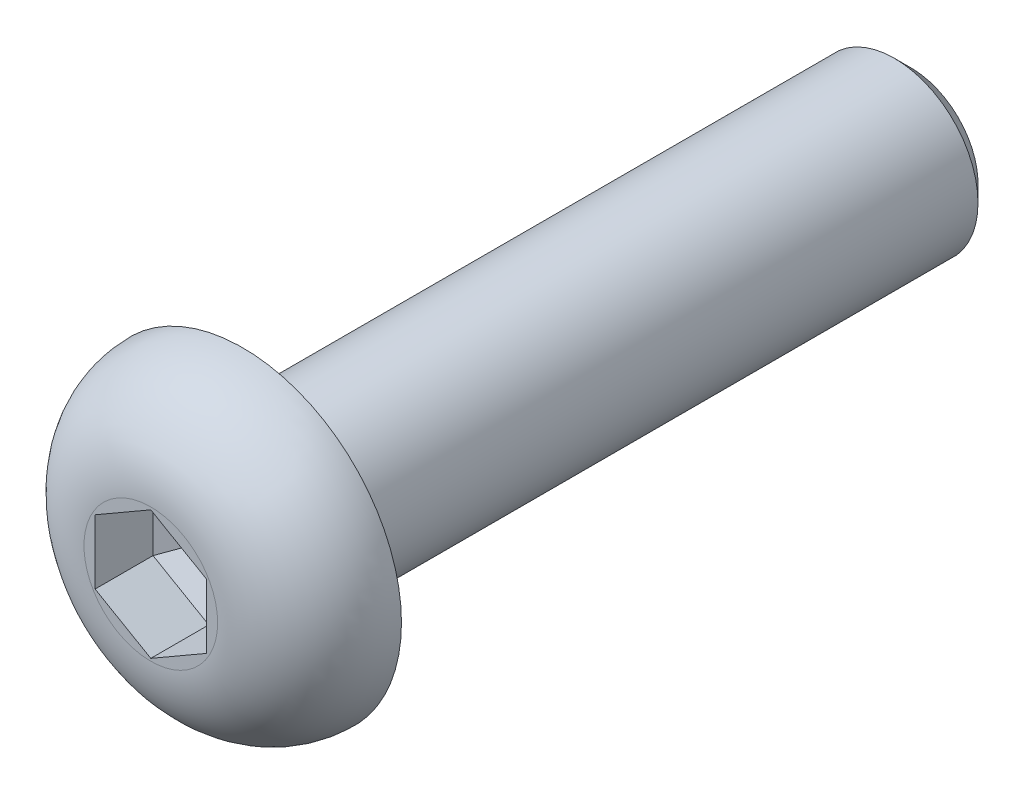
ISO-10303-21;
HEADER;
FILE_DESCRIPTION(('STEP AP214'),'2;1');
FILE_NAME('part.step','',(''),(''),'','','');
FILE_SCHEMA(('AUTOMOTIVE_DESIGN { 1 0 10303 214 1 1 1 1 }'));
ENDSEC;
DATA;
#1=APPLICATION_CONTEXT('core data for automotive mechanical design processes');
#2=APPLICATION_PROTOCOL_DEFINITION('international standard','automotive_design',2000,#1);
#3=PRODUCT_CONTEXT('',#1,'mechanical');
#4=PRODUCT('Part','Part','',(#3));
#5=PRODUCT_RELATED_PRODUCT_CATEGORY('part','',(#4));
#6=PRODUCT_DEFINITION_FORMATION('','',#4);
#7=PRODUCT_DEFINITION_CONTEXT('part definition',#1,'design');
#8=PRODUCT_DEFINITION('design','',#6,#7);
#9=PRODUCT_DEFINITION_SHAPE('','',#8);
#10=(LENGTH_UNIT() NAMED_UNIT(*) SI_UNIT(.MILLI.,.METRE.));
#11=(NAMED_UNIT(*) PLANE_ANGLE_UNIT() SI_UNIT($,.RADIAN.));
#12=(NAMED_UNIT(*) SI_UNIT($,.STERADIAN.) SOLID_ANGLE_UNIT());
#13=UNCERTAINTY_MEASURE_WITH_UNIT(LENGTH_MEASURE(1.E-05),#10,'distance_accuracy_value','');
#14=(GEOMETRIC_REPRESENTATION_CONTEXT(3) GLOBAL_UNCERTAINTY_ASSIGNED_CONTEXT((#13)) GLOBAL_UNIT_ASSIGNED_CONTEXT((#10,
#11,#12)) REPRESENTATION_CONTEXT('',''));
#15=CARTESIAN_POINT('',(0.,0.,0.));
#16=DIRECTION('',(0.,0.,1.));
#17=DIRECTION('',(1.,0.,0.));
#18=AXIS2_PLACEMENT_3D('',#15,#16,#17);
#19=CARTESIAN_POINT('',(0.,0.,0.));
#20=DIRECTION('',(0.,0.,1.));
#21=DIRECTION('',(1.,0.,0.));
#22=AXIS2_PLACEMENT_3D('',#19,#20,#21);
#23=PLANE('',#22);
#24=CARTESIAN_POINT('',(0.,0.,0.));
#25=DIRECTION('',(0.,0.,1.));
#26=DIRECTION('',(1.,0.,0.));
#27=AXIS2_PLACEMENT_3D('',#24,#25,#26);
#28=CIRCLE('',#27,1.6);
#29=CARTESIAN_POINT('',(1.6,0.,0.));
#30=VERTEX_POINT('',#29);
#31=EDGE_CURVE('E11',#30,#30,#28,.T.);
#32=ORIENTED_EDGE('',*,*,#31,.T.);
#33=EDGE_LOOP('',(#32));
#34=FACE_BOUND('',#33,.T.);
#35=CARTESIAN_POINT('',(0.,0.,0.));
#36=DIRECTION('',(0.,0.,1.));
#37=DIRECTION('',(1.,0.,0.));
#38=AXIS2_PLACEMENT_3D('',#35,#36,#37);
#39=CIRCLE('',#38,2.85);
#40=CARTESIAN_POINT('',(2.85,0.,0.));
#41=VERTEX_POINT('',#40);
#42=EDGE_CURVE('E148',#41,#41,#39,.T.);
#43=ORIENTED_EDGE('',*,*,#42,.F.);
#44=EDGE_LOOP('',(#43));
#45=FACE_BOUND('',#44,.T.);
#46=ADVANCED_FACE('F40',(#34,#45),#23,.F.);
#47=CARTESIAN_POINT('',(0.,0.,1.65));
#48=DIRECTION('',(0.,0.,1.));
#49=DIRECTION('',(1.,0.,0.));
#50=AXIS2_PLACEMENT_3D('',#47,#48,#49);
#51=PLANE('',#50);
#52=DIRECTION('',(0.,1.,0.));
#53=VECTOR('',#52,1.);
#54=CARTESIAN_POINT('',(1.,-0.577350269189626,1.65));
#55=LINE('',#54,#53);
#56=CARTESIAN_POINT('',(1.,-0.577350269189626,1.65));
#57=VERTEX_POINT('',#56);
#58=CARTESIAN_POINT('',(1.,0.577350269189626,1.65));
#59=VERTEX_POINT('',#58);
#60=EDGE_CURVE('E129',#57,#59,#55,.T.);
#61=ORIENTED_EDGE('',*,*,#60,.F.);
#62=DIRECTION('',(0.866025403784439,0.5,0.));
#63=VECTOR('',#62,1.);
#64=CARTESIAN_POINT('',(0.,-1.15470053837925,1.65));
#65=LINE('',#64,#63);
#66=CARTESIAN_POINT('',(0.,-1.15470053837925,1.65));
#67=VERTEX_POINT('',#66);
#68=EDGE_CURVE('E143',#67,#57,#65,.T.);
#69=ORIENTED_EDGE('',*,*,#68,.F.);
#70=DIRECTION('',(0.866025403784439,-0.5,0.));
#71=VECTOR('',#70,1.);
#72=CARTESIAN_POINT('',(-1.,-0.577350269189626,1.65));
#73=LINE('',#72,#71);
#74=CARTESIAN_POINT('',(-1.,-0.577350269189626,1.65));
#75=VERTEX_POINT('',#74);
#76=EDGE_CURVE('E137',#75,#67,#73,.T.);
#77=ORIENTED_EDGE('',*,*,#76,.F.);
#78=DIRECTION('',(0.,-1.,0.));
#79=VECTOR('',#78,1.);
#80=CARTESIAN_POINT('',(-1.,0.577350269189626,1.65));
#81=LINE('',#80,#79);
#82=CARTESIAN_POINT('',(-1.,0.577350269189626,1.65));
#83=VERTEX_POINT('',#82);
#84=EDGE_CURVE('E135',#83,#75,#81,.T.);
#85=ORIENTED_EDGE('',*,*,#84,.F.);
#86=DIRECTION('',(-0.866025403784439,-0.5,0.));
#87=VECTOR('',#86,1.);
#88=CARTESIAN_POINT('',(0.,1.15470053837925,1.65));
#89=LINE('',#88,#87);
#90=CARTESIAN_POINT('',(0.,1.15470053837925,1.65));
#91=VERTEX_POINT('',#90);
#92=EDGE_CURVE('E116',#91,#83,#89,.T.);
#93=ORIENTED_EDGE('',*,*,#92,.F.);
#94=DIRECTION('',(-0.866025403784439,0.5,0.));
#95=VECTOR('',#94,1.);
#96=CARTESIAN_POINT('',(1.,0.577350269189626,1.65));
#97=LINE('',#96,#95);
#98=EDGE_CURVE('E124',#59,#91,#97,.T.);
#99=ORIENTED_EDGE('',*,*,#98,.F.);
#100=EDGE_LOOP('',(#61,#69,#77,#85,#93,#99));
#101=FACE_BOUND('',#100,.T.);
#102=CARTESIAN_POINT('',(0.,0.,1.65));
#103=DIRECTION('',(0.,0.,1.));
#104=DIRECTION('',(1.,0.,0.));
#105=AXIS2_PLACEMENT_3D('',#102,#103,#104);
#106=CIRCLE('',#105,1.2);
#107=CARTESIAN_POINT('',(1.2,0.,1.65));
#108=VERTEX_POINT('',#107);
#109=EDGE_CURVE('E157',#108,#108,#106,.T.);
#110=ORIENTED_EDGE('',*,*,#109,.T.);
#111=EDGE_LOOP('',(#110));
#112=FACE_BOUND('',#111,.T.);
#113=ADVANCED_FACE('F131',(#101,#112),#51,.T.);
#114=CARTESIAN_POINT('',(0.,0.,0.));
#115=DIRECTION('',(0.,0.,1.));
#116=DIRECTION('',(1.,0.,0.));
#117=AXIS2_PLACEMENT_3D('',#114,#115,#116);
#118=DEGENERATE_TOROIDAL_SURFACE('',#117,1.2,1.65,.T.);
#119=ORIENTED_EDGE('',*,*,#42,.T.);
#120=EDGE_LOOP('',(#119));
#121=FACE_BOUND('',#120,.T.);
#122=ORIENTED_EDGE('',*,*,#109,.F.);
#123=EDGE_LOOP('',(#122));
#124=FACE_BOUND('',#123,.T.);
#125=ADVANCED_FACE('F226',(#121,#124),#118,.T.);
#126=CARTESIAN_POINT('',(0.,0.,-12.));
#127=DIRECTION('',(0.,0.,1.));
#128=DIRECTION('',(1.,0.,0.));
#129=AXIS2_PLACEMENT_3D('',#126,#127,#128);
#130=CYLINDRICAL_SURFACE('',#129,1.5);
#131=CARTESIAN_POINT('',(0.,0.,-0.0999999999999994));
#132=DIRECTION('',(0.,0.,1.));
#133=DIRECTION('',(1.,0.,0.));
#134=AXIS2_PLACEMENT_3D('',#131,#132,#133);
#135=CIRCLE('',#134,1.5);
#136=CARTESIAN_POINT('',(1.5,0.,-0.0999999999999994));
#137=VERTEX_POINT('',#136);
#138=EDGE_CURVE('E48',#137,#137,#135,.F.);
#139=ORIENTED_EDGE('',*,*,#138,.T.);
#140=EDGE_LOOP('',(#139));
#141=FACE_BOUND('',#140,.T.);
#142=CARTESIAN_POINT('',(0.,0.,-11.7));
#143=DIRECTION('',(0.,0.,-1.));
#144=DIRECTION('',(-1.,0.,0.));
#145=AXIS2_PLACEMENT_3D('',#142,#143,#144);
#146=CIRCLE('',#145,1.5);
#147=CARTESIAN_POINT('',(-1.5,0.,-11.7));
#148=VERTEX_POINT('',#147);
#149=EDGE_CURVE('E163',#148,#148,#146,.F.);
#150=ORIENTED_EDGE('',*,*,#149,.T.);
#151=EDGE_LOOP('',(#150));
#152=FACE_BOUND('',#151,.T.);
#153=ADVANCED_FACE('F207',(#141,#152),#130,.T.);
#154=CARTESIAN_POINT('',(0.,0.,-12.));
#155=DIRECTION('',(0.,0.,-1.));
#156=DIRECTION('',(-1.,0.,0.));
#157=AXIS2_PLACEMENT_3D('',#154,#155,#156);
#158=PLANE('',#157);
#159=CARTESIAN_POINT('',(0.,0.,-12.));
#160=DIRECTION('',(0.,0.,-1.));
#161=DIRECTION('',(-1.,0.,0.));
#162=AXIS2_PLACEMENT_3D('',#159,#160,#161);
#163=CIRCLE('',#162,1.2);
#164=CARTESIAN_POINT('',(-1.2,0.,-12.));
#165=VERTEX_POINT('',#164);
#166=EDGE_CURVE('E160',#165,#165,#163,.T.);
#167=ORIENTED_EDGE('',*,*,#166,.T.);
#168=EDGE_LOOP('',(#167));
#169=FACE_BOUND('',#168,.T.);
#170=ADVANCED_FACE('F301',(#169),#158,.T.);
#171=CARTESIAN_POINT('',(1.,-0.577350269189626,0.0336311239193085));
#172=DIRECTION('',(1.,0.,0.));
#173=DIRECTION('',(0.,0.,-1.));
#174=AXIS2_PLACEMENT_3D('',#171,#172,#173);
#175=PLANE('',#174);
#176=DIRECTION('',(0.,0.,1.));
#177=VECTOR('',#176,1.);
#178=CARTESIAN_POINT('',(1.,0.577350269189626,0.0336311239193085));
#179=LINE('',#178,#177);
#180=CARTESIAN_POINT('',(1.,0.577350269189626,0.609999999999998));
#181=VERTEX_POINT('',#180);
#182=EDGE_CURVE('E121',#181,#59,#179,.T.);
#183=ORIENTED_EDGE('',*,*,#182,.F.);
#184=DIRECTION('',(0.,-1.,0.));
#185=VECTOR('',#184,1.);
#186=CARTESIAN_POINT('',(1.,-0.577350269189626,0.609999999999998));
#187=LINE('',#186,#185);
#188=CARTESIAN_POINT('',(1.,-0.577350269189626,0.609999999999998));
#189=VERTEX_POINT('',#188);
#190=EDGE_CURVE('E55',#181,#189,#187,.T.);
#191=ORIENTED_EDGE('',*,*,#190,.T.);
#192=DIRECTION('',(0.,0.,1.));
#193=VECTOR('',#192,1.);
#194=CARTESIAN_POINT('',(1.,-0.577350269189626,0.0336311239193085));
#195=LINE('',#194,#193);
#196=EDGE_CURVE('E146',#189,#57,#195,.T.);
#197=ORIENTED_EDGE('',*,*,#196,.T.);
#198=ORIENTED_EDGE('',*,*,#60,.T.);
#199=EDGE_LOOP('',(#183,#191,#197,#198));
#200=FACE_BOUND('',#199,.T.);
#201=ADVANCED_FACE('F292',(#200),#175,.F.);
#202=CARTESIAN_POINT('',(0.,-1.15470053837925,0.0336311239193085));
#203=DIRECTION('',(0.5,-0.866025403784439,0.));
#204=DIRECTION('',(0.866025403784439,0.5,0.));
#205=AXIS2_PLACEMENT_3D('',#202,#203,#204);
#206=PLANE('',#205);
#207=ORIENTED_EDGE('',*,*,#196,.F.);
#208=DIRECTION('',(-0.866025403784439,-0.5,0.));
#209=VECTOR('',#208,1.);
#210=CARTESIAN_POINT('',(0.,-1.15470053837925,0.609999999999998));
#211=LINE('',#210,#209);
#212=CARTESIAN_POINT('',(0.,-1.15470053837925,0.609999999999998));
#213=VERTEX_POINT('',#212);
#214=EDGE_CURVE('E186',#189,#213,#211,.T.);
#215=ORIENTED_EDGE('',*,*,#214,.T.);
#216=DIRECTION('',(0.,0.,1.));
#217=VECTOR('',#216,1.);
#218=CARTESIAN_POINT('',(0.,-1.15470053837925,0.0336311239193085));
#219=LINE('',#218,#217);
#220=EDGE_CURVE('E149',#213,#67,#219,.T.);
#221=ORIENTED_EDGE('',*,*,#220,.T.);
#222=ORIENTED_EDGE('',*,*,#68,.T.);
#223=EDGE_LOOP('',(#207,#215,#221,#222));
#224=FACE_BOUND('',#223,.T.);
#225=ADVANCED_FACE('F268',(#224),#206,.F.);
#226=CARTESIAN_POINT('',(-1.,-0.577350269189626,0.0336311239193085));
#227=DIRECTION('',(-0.5,-0.866025403784439,0.));
#228=DIRECTION('',(0.866025403784439,-0.5,0.));
#229=AXIS2_PLACEMENT_3D('',#226,#227,#228);
#230=PLANE('',#229);
#231=ORIENTED_EDGE('',*,*,#220,.F.);
#232=DIRECTION('',(-0.866025403784439,0.5,0.));
#233=VECTOR('',#232,1.);
#234=CARTESIAN_POINT('',(-1.,-0.577350269189626,0.609999999999998));
#235=LINE('',#234,#233);
#236=CARTESIAN_POINT('',(-1.,-0.577350269189626,0.609999999999998));
#237=VERTEX_POINT('',#236);
#238=EDGE_CURVE('E179',#213,#237,#235,.T.);
#239=ORIENTED_EDGE('',*,*,#238,.T.);
#240=DIRECTION('',(0.,0.,1.));
#241=VECTOR('',#240,1.);
#242=CARTESIAN_POINT('',(-1.,-0.577350269189626,0.0336311239193085));
#243=LINE('',#242,#241);
#244=EDGE_CURVE('E151',#237,#75,#243,.T.);
#245=ORIENTED_EDGE('',*,*,#244,.T.);
#246=ORIENTED_EDGE('',*,*,#76,.T.);
#247=EDGE_LOOP('',(#231,#239,#245,#246));
#248=FACE_BOUND('',#247,.T.);
#249=ADVANCED_FACE('F271',(#248),#230,.F.);
#250=CARTESIAN_POINT('',(-1.,0.577350269189626,0.0336311239193085));
#251=DIRECTION('',(-1.,0.,0.));
#252=DIRECTION('',(0.,0.,1.));
#253=AXIS2_PLACEMENT_3D('',#250,#251,#252);
#254=PLANE('',#253);
#255=ORIENTED_EDGE('',*,*,#244,.F.);
#256=DIRECTION('',(0.,1.,0.));
#257=VECTOR('',#256,1.);
#258=CARTESIAN_POINT('',(-1.,0.577350269189626,0.609999999999998));
#259=LINE('',#258,#257);
#260=CARTESIAN_POINT('',(-1.,0.577350269189626,0.609999999999998));
#261=VERTEX_POINT('',#260);
#262=EDGE_CURVE('E182',#237,#261,#259,.T.);
#263=ORIENTED_EDGE('',*,*,#262,.T.);
#264=DIRECTION('',(0.,0.,1.));
#265=VECTOR('',#264,1.);
#266=CARTESIAN_POINT('',(-1.,0.577350269189626,0.0336311239193085));
#267=LINE('',#266,#265);
#268=EDGE_CURVE('E120',#261,#83,#267,.T.);
#269=ORIENTED_EDGE('',*,*,#268,.T.);
#270=ORIENTED_EDGE('',*,*,#84,.T.);
#271=EDGE_LOOP('',(#255,#263,#269,#270));
#272=FACE_BOUND('',#271,.T.);
#273=ADVANCED_FACE('F280',(#272),#254,.F.);
#274=CARTESIAN_POINT('',(0.,1.15470053837925,0.0336311239193085));
#275=DIRECTION('',(-0.5,0.866025403784439,0.));
#276=DIRECTION('',(-0.866025403784439,-0.5,0.));
#277=AXIS2_PLACEMENT_3D('',#274,#275,#276);
#278=PLANE('',#277);
#279=ORIENTED_EDGE('',*,*,#268,.F.);
#280=DIRECTION('',(0.866025403784439,0.5,0.));
#281=VECTOR('',#280,1.);
#282=CARTESIAN_POINT('',(0.,1.15470053837925,0.609999999999998));
#283=LINE('',#282,#281);
#284=CARTESIAN_POINT('',(0.,1.15470053837925,0.609999999999998));
#285=VERTEX_POINT('',#284);
#286=EDGE_CURVE('E119',#261,#285,#283,.T.);
#287=ORIENTED_EDGE('',*,*,#286,.T.);
#288=DIRECTION('',(0.,0.,1.));
#289=VECTOR('',#288,1.);
#290=CARTESIAN_POINT('',(0.,1.15470053837925,0.0336311239193085));
#291=LINE('',#290,#289);
#292=EDGE_CURVE('E111',#285,#91,#291,.T.);
#293=ORIENTED_EDGE('',*,*,#292,.T.);
#294=ORIENTED_EDGE('',*,*,#92,.T.);
#295=EDGE_LOOP('',(#279,#287,#293,#294));
#296=FACE_BOUND('',#295,.T.);
#297=ADVANCED_FACE('F114',(#296),#278,.F.);
#298=CARTESIAN_POINT('',(1.,0.577350269189626,0.0336311239193085));
#299=DIRECTION('',(0.5,0.866025403784439,0.));
#300=DIRECTION('',(-0.866025403784439,0.5,0.));
#301=AXIS2_PLACEMENT_3D('',#298,#299,#300);
#302=PLANE('',#301);
#303=ORIENTED_EDGE('',*,*,#292,.F.);
#304=DIRECTION('',(0.866025403784439,-0.5,0.));
#305=VECTOR('',#304,1.);
#306=CARTESIAN_POINT('',(1.,0.577350269189626,0.609999999999998));
#307=LINE('',#306,#305);
#308=EDGE_CURVE('E63',#285,#181,#307,.T.);
#309=ORIENTED_EDGE('',*,*,#308,.T.);
#310=ORIENTED_EDGE('',*,*,#182,.T.);
#311=ORIENTED_EDGE('',*,*,#98,.T.);
#312=EDGE_LOOP('',(#303,#309,#310,#311));
#313=FACE_BOUND('',#312,.T.);
#314=ADVANCED_FACE('F125',(#313),#302,.F.);
#315=CARTESIAN_POINT('',(0.,0.,0.0336311239193085));
#316=DIRECTION('',(0.,0.,1.));
#317=DIRECTION('',(1.,0.,0.));
#318=AXIS2_PLACEMENT_3D('',#315,#316,#317);
#319=PLANE('',#318);
#320=DIRECTION('',(0.,-1.,0.));
#321=VECTOR('',#320,1.);
#322=CARTESIAN_POINT('',(-0.00169982272686209,0.,0.0336311239193085));
#323=LINE('',#322,#321);
#324=CARTESIAN_POINT('',(-0.00169982272686209,0.000981393108929031,0.0336311239193085));
#325=VERTEX_POINT('',#324);
#326=CARTESIAN_POINT('',(-0.00169982272686209,-0.000981393108928444,0.0336311239193085));
#327=VERTEX_POINT('',#326);
#328=EDGE_CURVE('E174',#325,#327,#323,.T.);
#329=ORIENTED_EDGE('',*,*,#328,.T.);
#330=DIRECTION('',(0.866025403784439,-0.5,0.));
#331=VECTOR('',#330,1.);
#332=CARTESIAN_POINT('',(-0.000849911363431016,-0.00147208966339266,0.0336311239193085));
#333=LINE('',#332,#331);
#334=CARTESIAN_POINT('',(0.,-0.00196278621785735,0.0336311239193085));
#335=VERTEX_POINT('',#334);
#336=EDGE_CURVE('E176',#327,#335,#333,.T.);
#337=ORIENTED_EDGE('',*,*,#336,.T.);
#338=DIRECTION('',(0.866025403784439,0.5,0.));
#339=VECTOR('',#338,1.);
#340=CARTESIAN_POINT('',(0.00084991136343145,-0.00147208966339341,0.0336311239193085));
#341=LINE('',#340,#339);
#342=CARTESIAN_POINT('',(0.0016998227268623,-0.000981393108929315,0.0336311239193085));
#343=VERTEX_POINT('',#342);
#344=EDGE_CURVE('E168',#335,#343,#341,.T.);
#345=ORIENTED_EDGE('',*,*,#344,.T.);
#346=DIRECTION('',(0.,1.,0.));
#347=VECTOR('',#346,1.);
#348=CARTESIAN_POINT('',(0.0016998227268623,0.,0.0336311239193085));
#349=LINE('',#348,#347);
#350=CARTESIAN_POINT('',(0.0016998227268623,0.000981393108928427,0.0336311239193085));
#351=VERTEX_POINT('',#350);
#352=EDGE_CURVE('E166',#343,#351,#349,.T.);
#353=ORIENTED_EDGE('',*,*,#352,.T.);
#354=DIRECTION('',(-0.866025403784439,0.5,0.));
#355=VECTOR('',#354,1.);
#356=CARTESIAN_POINT('',(0.00084991136343107,0.00147208966339275,0.0336311239193085));
#357=LINE('',#356,#355);
#358=CARTESIAN_POINT('',(0.,0.0019627862178572,0.0336311239193085));
#359=VERTEX_POINT('',#358);
#360=EDGE_CURVE('E170',#351,#359,#357,.T.);
#361=ORIENTED_EDGE('',*,*,#360,.T.);
#362=DIRECTION('',(-0.866025403784439,-0.5,0.));
#363=VECTOR('',#362,1.);
#364=CARTESIAN_POINT('',(-0.00084991136343126,0.00147208966339308,0.0336311239193085));
#365=LINE('',#364,#363);
#366=EDGE_CURVE('E172',#359,#325,#365,.T.);
#367=ORIENTED_EDGE('',*,*,#366,.T.);
#368=EDGE_LOOP('',(#329,#337,#345,#353,#361,#367));
#369=FACE_BOUND('',#368,.T.);
#370=ADVANCED_FACE('F237',(#369),#319,.T.);
#371=CARTESIAN_POINT('',(0.,0.,-12.));
#372=DIRECTION('',(0.,0.,1.));
#373=DIRECTION('',(1.,0.,0.));
#374=AXIS2_PLACEMENT_3D('',#371,#372,#373);
#375=CONICAL_SURFACE('',#374,1.2,0.785398163397447);
#376=ORIENTED_EDGE('',*,*,#149,.F.);
#377=EDGE_LOOP('',(#376));
#378=FACE_BOUND('',#377,.T.);
#379=ORIENTED_EDGE('',*,*,#166,.F.);
#380=EDGE_LOOP('',(#379));
#381=FACE_BOUND('',#380,.T.);
#382=ADVANCED_FACE('F234',(#378,#381),#375,.T.);
#383=CARTESIAN_POINT('',(0.00084991136343107,0.00147208966339275,0.0336311239193085));
#384=DIRECTION('',(0.249999999999998,0.433012701892215,-0.866025403784441));
#385=DIRECTION('',(-0.866025403784439,0.5,0.));
#386=AXIS2_PLACEMENT_3D('',#383,#384,#385);
#387=PLANE('',#386);
#388=DIRECTION('',(-0.774596669241485,-0.447213595499959,-0.447213595499953));
#389=VECTOR('',#388,1.);
#390=CARTESIAN_POINT('',(0.00135985818148981,0.000785114487142668,0.0334348452975228));
#391=LINE('',#390,#389);
#392=EDGE_CURVE('E199',#181,#351,#391,.T.);
#393=ORIENTED_EDGE('',*,*,#392,.F.);
#394=ORIENTED_EDGE('',*,*,#308,.F.);
#395=DIRECTION('',(0.,-0.894427190999918,-0.447213595499953));
#396=VECTOR('',#395,1.);
#397=CARTESIAN_POINT('',(0.,0.00157022897428595,0.0334348452975229));
#398=LINE('',#397,#396);
#399=EDGE_CURVE('E202',#359,#285,#398,.F.);
#400=ORIENTED_EDGE('',*,*,#399,.F.);
#401=ORIENTED_EDGE('',*,*,#360,.F.);
#402=EDGE_LOOP('',(#393,#394,#400,#401));
#403=FACE_BOUND('',#402,.T.);
#404=ADVANCED_FACE('F236',(#403),#387,.F.);
#405=CARTESIAN_POINT('',(-0.000849911363431287,0.00147208966339313,0.0336311239193085));
#406=DIRECTION('',(-0.249999999999997,0.433012701892215,-0.866025403784441));
#407=DIRECTION('',(-0.866025403784439,-0.5,0.));
#408=AXIS2_PLACEMENT_3D('',#405,#406,#407);
#409=PLANE('',#408);
#410=ORIENTED_EDGE('',*,*,#399,.T.);
#411=ORIENTED_EDGE('',*,*,#286,.F.);
#412=DIRECTION('',(0.774596669241485,-0.447213595499959,-0.447213595499953));
#413=VECTOR('',#412,1.);
#414=CARTESIAN_POINT('',(-0.00135985818148947,0.000785114487143225,0.0334348452975227));
#415=LINE('',#414,#413);
#416=EDGE_CURVE('E196',#325,#261,#415,.F.);
#417=ORIENTED_EDGE('',*,*,#416,.F.);
#418=ORIENTED_EDGE('',*,*,#366,.F.);
#419=EDGE_LOOP('',(#410,#411,#417,#418));
#420=FACE_BOUND('',#419,.T.);
#421=ADVANCED_FACE('F250',(#420),#409,.F.);
#422=CARTESIAN_POINT('',(0.0016998227268623,0.,0.0336311239193085));
#423=DIRECTION('',(0.499999999999995,0.,-0.866025403784441));
#424=DIRECTION('',(0.,1.,0.));
#425=AXIS2_PLACEMENT_3D('',#422,#423,#424);
#426=PLANE('',#425);
#427=ORIENTED_EDGE('',*,*,#392,.T.);
#428=ORIENTED_EDGE('',*,*,#352,.F.);
#429=DIRECTION('',(0.774596669241485,-0.447213595499959,0.447213595499953));
#430=VECTOR('',#429,1.);
#431=CARTESIAN_POINT('',(0.00135985818148995,-0.000785114487143563,0.0334348452975229));
#432=LINE('',#431,#430);
#433=EDGE_CURVE('E193',#189,#343,#432,.F.);
#434=ORIENTED_EDGE('',*,*,#433,.F.);
#435=ORIENTED_EDGE('',*,*,#190,.F.);
#436=EDGE_LOOP('',(#427,#428,#434,#435));
#437=FACE_BOUND('',#436,.T.);
#438=ADVANCED_FACE('F246',(#437),#426,.F.);
#439=CARTESIAN_POINT('',(-0.00169982272686209,0.,0.0336311239193085));
#440=DIRECTION('',(-0.499999999999995,0.,-0.866025403784441));
#441=DIRECTION('',(0.,-1.,0.));
#442=AXIS2_PLACEMENT_3D('',#439,#440,#441);
#443=PLANE('',#442);
#444=ORIENTED_EDGE('',*,*,#416,.T.);
#445=ORIENTED_EDGE('',*,*,#262,.F.);
#446=DIRECTION('',(0.774596669241486,0.447213595499959,-0.447213595499953));
#447=VECTOR('',#446,1.);
#448=CARTESIAN_POINT('',(-0.00135985818148966,-0.000785114487142705,0.0334348452975228));
#449=LINE('',#448,#447);
#450=EDGE_CURVE('E191',#327,#237,#449,.F.);
#451=ORIENTED_EDGE('',*,*,#450,.F.);
#452=ORIENTED_EDGE('',*,*,#328,.F.);
#453=EDGE_LOOP('',(#444,#445,#451,#452));
#454=FACE_BOUND('',#453,.T.);
#455=ADVANCED_FACE('F242',(#454),#443,.F.);
#456=CARTESIAN_POINT('',(0.000849911363431423,-0.00147208966339336,0.0336311239193085));
#457=DIRECTION('',(0.249999999999998,-0.433012701892215,-0.866025403784442));
#458=DIRECTION('',(0.866025403784439,0.5,0.));
#459=AXIS2_PLACEMENT_3D('',#456,#457,#458);
#460=PLANE('',#459);
#461=ORIENTED_EDGE('',*,*,#433,.T.);
#462=ORIENTED_EDGE('',*,*,#344,.F.);
#463=DIRECTION('',(0.,-0.894427190999918,0.447213595499953));
#464=VECTOR('',#463,1.);
#465=CARTESIAN_POINT('',(0.,-0.00157022897428559,0.0334348452975226));
#466=LINE('',#465,#464);
#467=EDGE_CURVE('E189',#213,#335,#466,.F.);
#468=ORIENTED_EDGE('',*,*,#467,.F.);
#469=ORIENTED_EDGE('',*,*,#214,.F.);
#470=EDGE_LOOP('',(#461,#462,#468,#469));
#471=FACE_BOUND('',#470,.T.);
#472=ADVANCED_FACE('F216',(#471),#460,.F.);
#473=CARTESIAN_POINT('',(-0.000849911363431016,-0.00147208966339266,0.0336311239193085));
#474=DIRECTION('',(-0.249999999999998,-0.433012701892215,-0.866025403784441));
#475=DIRECTION('',(0.866025403784439,-0.5,0.));
#476=AXIS2_PLACEMENT_3D('',#473,#474,#475);
#477=PLANE('',#476);
#478=ORIENTED_EDGE('',*,*,#450,.T.);
#479=ORIENTED_EDGE('',*,*,#238,.F.);
#480=ORIENTED_EDGE('',*,*,#467,.T.);
#481=ORIENTED_EDGE('',*,*,#336,.F.);
#482=EDGE_LOOP('',(#478,#479,#480,#481));
#483=FACE_BOUND('',#482,.T.);
#484=ADVANCED_FACE('F211',(#483),#477,.F.);
#485=CARTESIAN_POINT('',(0.,0.,-0.0999999999999994));
#486=DIRECTION('',(0.,0.,1.));
#487=DIRECTION('',(1.,0.,0.));
#488=AXIS2_PLACEMENT_3D('',#485,#486,#487);
#489=TOROIDAL_SURFACE('',#488,1.6,0.1);
#490=ORIENTED_EDGE('',*,*,#31,.F.);
#491=EDGE_LOOP('',(#490));
#492=FACE_BOUND('',#491,.T.);
#493=ORIENTED_EDGE('',*,*,#138,.F.);
#494=EDGE_LOOP('',(#493));
#495=FACE_BOUND('',#494,.T.);
#496=ADVANCED_FACE('F42',(#492,#495),#489,.F.);
#497=CLOSED_SHELL('',(#46,#113,#125,#153,#170,#201,#225,#249,#273,#297,#314,#370,#382,#404,#421,
#438,#455,#472,#484,#496));
#498=MANIFOLD_SOLID_BREP('B2',#497);
#499=ADVANCED_BREP_SHAPE_REPRESENTATION('',(#18,#498),#14);
#500=SHAPE_DEFINITION_REPRESENTATION(#9,#499);
ENDSEC;
END-ISO-10303-21;
